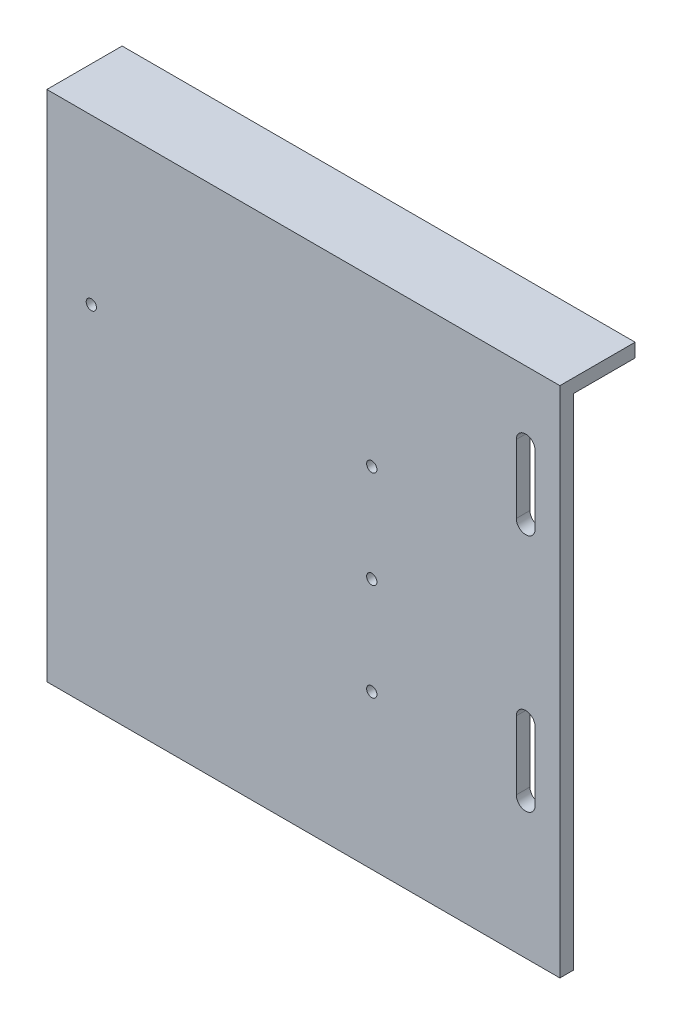
ISO-10303-21;
HEADER;
FILE_DESCRIPTION(('STEP AP214'),'2;1');
FILE_NAME('part.step','',(''),(''),'','','');
FILE_SCHEMA(('AUTOMOTIVE_DESIGN { 1 0 10303 214 1 1 1 1 }'));
ENDSEC;
DATA;
#1=APPLICATION_CONTEXT('core data for automotive mechanical design processes');
#2=APPLICATION_PROTOCOL_DEFINITION('international standard','automotive_design',2000,#1);
#3=PRODUCT_CONTEXT('',#1,'mechanical');
#4=PRODUCT('Part','Part','',(#3));
#5=PRODUCT_RELATED_PRODUCT_CATEGORY('part','',(#4));
#6=PRODUCT_DEFINITION_FORMATION('','',#4);
#7=PRODUCT_DEFINITION_CONTEXT('part definition',#1,'design');
#8=PRODUCT_DEFINITION('design','',#6,#7);
#9=PRODUCT_DEFINITION_SHAPE('','',#8);
#10=(LENGTH_UNIT() NAMED_UNIT(*) SI_UNIT(.MILLI.,.METRE.));
#11=(NAMED_UNIT(*) PLANE_ANGLE_UNIT() SI_UNIT($,.RADIAN.));
#12=(NAMED_UNIT(*) SI_UNIT($,.STERADIAN.) SOLID_ANGLE_UNIT());
#13=UNCERTAINTY_MEASURE_WITH_UNIT(LENGTH_MEASURE(1.E-05),#10,'distance_accuracy_value','');
#14=(GEOMETRIC_REPRESENTATION_CONTEXT(3) GLOBAL_UNCERTAINTY_ASSIGNED_CONTEXT((#13)) GLOBAL_UNIT_ASSIGNED_CONTEXT((#10,
#11,#12)) REPRESENTATION_CONTEXT('',''));
#15=CARTESIAN_POINT('',(0.,0.,0.));
#16=DIRECTION('',(0.,0.,1.));
#17=DIRECTION('',(1.,0.,0.));
#18=AXIS2_PLACEMENT_3D('',#15,#16,#17);
#19=CARTESIAN_POINT('',(0.,0.,4.));
#20=DIRECTION('',(0.,0.,-1.));
#21=DIRECTION('',(-1.,0.,0.));
#22=AXIS2_PLACEMENT_3D('',#19,#20,#21);
#23=PLANE('',#22);
#24=CARTESIAN_POINT('',(140.,130.,4.));
#25=DIRECTION('',(0.,0.,1.));
#26=DIRECTION('',(1.,0.,0.));
#27=AXIS2_PLACEMENT_3D('',#24,#25,#26);
#28=CIRCLE('',#27,2.75000000000003);
#29=CARTESIAN_POINT('',(142.75,130.,4.));
#30=VERTEX_POINT('',#29);
#31=CARTESIAN_POINT('',(137.25,130.,4.));
#32=VERTEX_POINT('',#31);
#33=EDGE_CURVE('E219',#30,#32,#28,.T.);
#34=ORIENTED_EDGE('',*,*,#33,.F.);
#35=DIRECTION('',(0.,1.,0.));
#36=VECTOR('',#35,1.);
#37=CARTESIAN_POINT('',(142.75,130.,4.));
#38=LINE('',#37,#36);
#39=CARTESIAN_POINT('',(142.75,110.,4.));
#40=VERTEX_POINT('',#39);
#41=EDGE_CURVE('E227',#40,#30,#38,.T.);
#42=ORIENTED_EDGE('',*,*,#41,.F.);
#43=CARTESIAN_POINT('',(140.,110.,4.));
#44=DIRECTION('',(0.,0.,1.));
#45=DIRECTION('',(1.,0.,0.));
#46=AXIS2_PLACEMENT_3D('',#43,#44,#45);
#47=CIRCLE('',#46,2.75);
#48=CARTESIAN_POINT('',(137.25,110.,4.));
#49=VERTEX_POINT('',#48);
#50=EDGE_CURVE('E224',#49,#40,#47,.T.);
#51=ORIENTED_EDGE('',*,*,#50,.F.);
#52=DIRECTION('',(0.,-1.,0.));
#53=VECTOR('',#52,1.);
#54=CARTESIAN_POINT('',(137.25,130.,4.));
#55=LINE('',#54,#53);
#56=EDGE_CURVE('E221',#32,#49,#55,.T.);
#57=ORIENTED_EDGE('',*,*,#56,.F.);
#58=EDGE_LOOP('',(#34,#42,#51,#57));
#59=FACE_BOUND('',#58,.T.);
#60=DIRECTION('',(0.,-1.,0.));
#61=VECTOR('',#60,1.);
#62=CARTESIAN_POINT('',(0.,0.,4.));
#63=LINE('',#62,#61);
#64=CARTESIAN_POINT('',(0.,150.,4.));
#65=VERTEX_POINT('',#64);
#66=CARTESIAN_POINT('',(0.,0.,4.));
#67=VERTEX_POINT('',#66);
#68=EDGE_CURVE('E250',#65,#67,#63,.T.);
#69=ORIENTED_EDGE('',*,*,#68,.T.);
#70=DIRECTION('',(1.,0.,0.));
#71=VECTOR('',#70,1.);
#72=CARTESIAN_POINT('',(0.,0.,4.));
#73=LINE('',#72,#71);
#74=CARTESIAN_POINT('',(150.,0.,4.));
#75=VERTEX_POINT('',#74);
#76=EDGE_CURVE('E253',#67,#75,#73,.T.);
#77=ORIENTED_EDGE('',*,*,#76,.T.);
#78=DIRECTION('',(0.,1.,0.));
#79=VECTOR('',#78,1.);
#80=CARTESIAN_POINT('',(150.,0.,4.));
#81=LINE('',#80,#79);
#82=CARTESIAN_POINT('',(150.,150.,4.));
#83=VERTEX_POINT('',#82);
#84=EDGE_CURVE('E255',#75,#83,#81,.T.);
#85=ORIENTED_EDGE('',*,*,#84,.T.);
#86=DIRECTION('',(-1.,0.,0.));
#87=VECTOR('',#86,1.);
#88=CARTESIAN_POINT('',(0.,150.,4.));
#89=LINE('',#88,#87);
#90=EDGE_CURVE('E257',#83,#65,#89,.T.);
#91=ORIENTED_EDGE('',*,*,#90,.T.);
#92=EDGE_LOOP('',(#69,#77,#85,#91));
#93=FACE_BOUND('',#92,.T.);
#94=CARTESIAN_POINT('',(140.,60.,4.));
#95=DIRECTION('',(0.,0.,1.));
#96=DIRECTION('',(1.,0.,0.));
#97=AXIS2_PLACEMENT_3D('',#94,#95,#96);
#98=CIRCLE('',#97,2.74999999999997);
#99=CARTESIAN_POINT('',(142.75,60.,4.));
#100=VERTEX_POINT('',#99);
#101=CARTESIAN_POINT('',(137.25,60.,4.));
#102=VERTEX_POINT('',#101);
#103=EDGE_CURVE('E190',#100,#102,#98,.T.);
#104=ORIENTED_EDGE('',*,*,#103,.F.);
#105=DIRECTION('',(0.,1.,0.));
#106=VECTOR('',#105,1.);
#107=CARTESIAN_POINT('',(142.75,60.,4.));
#108=LINE('',#107,#106);
#109=CARTESIAN_POINT('',(142.75,40.,4.));
#110=VERTEX_POINT('',#109);
#111=EDGE_CURVE('E197',#110,#100,#108,.T.);
#112=ORIENTED_EDGE('',*,*,#111,.F.);
#113=CARTESIAN_POINT('',(140.,40.,4.));
#114=DIRECTION('',(0.,0.,1.));
#115=DIRECTION('',(1.,0.,0.));
#116=AXIS2_PLACEMENT_3D('',#113,#114,#115);
#117=CIRCLE('',#116,2.74999999999997);
#118=CARTESIAN_POINT('',(137.25,40.,4.));
#119=VERTEX_POINT('',#118);
#120=EDGE_CURVE('E195',#119,#110,#117,.T.);
#121=ORIENTED_EDGE('',*,*,#120,.F.);
#122=DIRECTION('',(0.,-1.,0.));
#123=VECTOR('',#122,1.);
#124=CARTESIAN_POINT('',(137.25,60.,4.));
#125=LINE('',#124,#123);
#126=EDGE_CURVE('E192',#102,#119,#125,.T.);
#127=ORIENTED_EDGE('',*,*,#126,.F.);
#128=EDGE_LOOP('',(#104,#112,#121,#127));
#129=FACE_BOUND('',#128,.T.);
#130=CARTESIAN_POINT('',(95.,102.,4.));
#131=DIRECTION('',(0.,0.,1.));
#132=DIRECTION('',(1.,0.,0.));
#133=AXIS2_PLACEMENT_3D('',#130,#131,#132);
#134=CIRCLE('',#133,1.5);
#135=CARTESIAN_POINT('',(96.5,102.,4.));
#136=VERTEX_POINT('',#135);
#137=EDGE_CURVE('E184',#136,#136,#134,.T.);
#138=ORIENTED_EDGE('',*,*,#137,.F.);
#139=EDGE_LOOP('',(#138));
#140=FACE_BOUND('',#139,.T.);
#141=CARTESIAN_POINT('',(95.,45.,4.));
#142=DIRECTION('',(0.,0.,1.));
#143=DIRECTION('',(1.,0.,0.));
#144=AXIS2_PLACEMENT_3D('',#141,#142,#143);
#145=CIRCLE('',#144,1.5);
#146=CARTESIAN_POINT('',(96.5,45.,4.));
#147=VERTEX_POINT('',#146);
#148=EDGE_CURVE('E178',#147,#147,#145,.T.);
#149=ORIENTED_EDGE('',*,*,#148,.F.);
#150=EDGE_LOOP('',(#149));
#151=FACE_BOUND('',#150,.T.);
#152=CARTESIAN_POINT('',(95.,73.5,4.));
#153=DIRECTION('',(0.,0.,1.));
#154=DIRECTION('',(1.,0.,0.));
#155=AXIS2_PLACEMENT_3D('',#152,#153,#154);
#156=CIRCLE('',#155,1.5);
#157=CARTESIAN_POINT('',(96.5,73.5,4.));
#158=VERTEX_POINT('',#157);
#159=EDGE_CURVE('E172',#158,#158,#156,.T.);
#160=ORIENTED_EDGE('',*,*,#159,.F.);
#161=EDGE_LOOP('',(#160));
#162=FACE_BOUND('',#161,.T.);
#163=CARTESIAN_POINT('',(13.,102.,4.));
#164=DIRECTION('',(0.,0.,1.));
#165=DIRECTION('',(1.,0.,0.));
#166=AXIS2_PLACEMENT_3D('',#163,#164,#165);
#167=CIRCLE('',#166,1.5);
#168=CARTESIAN_POINT('',(14.5,102.,4.));
#169=VERTEX_POINT('',#168);
#170=EDGE_CURVE('E164',#169,#169,#167,.T.);
#171=ORIENTED_EDGE('',*,*,#170,.F.);
#172=EDGE_LOOP('',(#171));
#173=FACE_BOUND('',#172,.T.);
#174=ADVANCED_FACE('F35',(#59,#93,#129,#140,#151,#162,#173),#23,.F.);
#175=CARTESIAN_POINT('',(0.,0.,0.));
#176=DIRECTION('',(0.,0.,-1.));
#177=DIRECTION('',(-1.,0.,0.));
#178=AXIS2_PLACEMENT_3D('',#175,#176,#177);
#179=PLANE('',#178);
#180=DIRECTION('',(-1.,0.,0.));
#181=VECTOR('',#180,1.);
#182=CARTESIAN_POINT('',(150.,146.,0.));
#183=LINE('',#182,#181);
#184=CARTESIAN_POINT('',(150.,146.,0.));
#185=VERTEX_POINT('',#184);
#186=CARTESIAN_POINT('',(0.,146.,0.));
#187=VERTEX_POINT('',#186);
#188=EDGE_CURVE('E50',#185,#187,#183,.T.);
#189=ORIENTED_EDGE('',*,*,#188,.F.);
#190=DIRECTION('',(0.,1.,0.));
#191=VECTOR('',#190,1.);
#192=CARTESIAN_POINT('',(150.,0.,0.));
#193=LINE('',#192,#191);
#194=CARTESIAN_POINT('',(150.,0.,0.));
#195=VERTEX_POINT('',#194);
#196=EDGE_CURVE('E160',#195,#185,#193,.T.);
#197=ORIENTED_EDGE('',*,*,#196,.F.);
#198=DIRECTION('',(1.,0.,0.));
#199=VECTOR('',#198,1.);
#200=CARTESIAN_POINT('',(0.,0.,0.));
#201=LINE('',#200,#199);
#202=CARTESIAN_POINT('',(0.,0.,0.));
#203=VERTEX_POINT('',#202);
#204=EDGE_CURVE('E261',#203,#195,#201,.T.);
#205=ORIENTED_EDGE('',*,*,#204,.F.);
#206=DIRECTION('',(0.,-1.,0.));
#207=VECTOR('',#206,1.);
#208=CARTESIAN_POINT('',(0.,0.,0.));
#209=LINE('',#208,#207);
#210=EDGE_CURVE('E249',#187,#203,#209,.T.);
#211=ORIENTED_EDGE('',*,*,#210,.F.);
#212=EDGE_LOOP('',(#189,#197,#205,#211));
#213=FACE_BOUND('',#212,.T.);
#214=CARTESIAN_POINT('',(95.,73.5,0.));
#215=DIRECTION('',(0.,0.,1.));
#216=DIRECTION('',(1.,0.,0.));
#217=AXIS2_PLACEMENT_3D('',#214,#215,#216);
#218=CIRCLE('',#217,1.5);
#219=CARTESIAN_POINT('',(96.5,73.5,0.));
#220=VERTEX_POINT('',#219);
#221=EDGE_CURVE('E170',#220,#220,#218,.T.);
#222=ORIENTED_EDGE('',*,*,#221,.T.);
#223=EDGE_LOOP('',(#222));
#224=FACE_BOUND('',#223,.T.);
#225=CARTESIAN_POINT('',(95.,102.,0.));
#226=DIRECTION('',(0.,0.,1.));
#227=DIRECTION('',(1.,0.,0.));
#228=AXIS2_PLACEMENT_3D('',#225,#226,#227);
#229=CIRCLE('',#228,1.5);
#230=CARTESIAN_POINT('',(96.5,102.,0.));
#231=VERTEX_POINT('',#230);
#232=EDGE_CURVE('E181',#231,#231,#229,.T.);
#233=ORIENTED_EDGE('',*,*,#232,.T.);
#234=EDGE_LOOP('',(#233));
#235=FACE_BOUND('',#234,.T.);
#236=DIRECTION('',(0.,1.,0.));
#237=VECTOR('',#236,1.);
#238=CARTESIAN_POINT('',(142.75,130.,0.));
#239=LINE('',#238,#237);
#240=CARTESIAN_POINT('',(142.75,110.,0.));
#241=VERTEX_POINT('',#240);
#242=CARTESIAN_POINT('',(142.75,130.,0.));
#243=VERTEX_POINT('',#242);
#244=EDGE_CURVE('E222',#241,#243,#239,.T.);
#245=ORIENTED_EDGE('',*,*,#244,.T.);
#246=CARTESIAN_POINT('',(140.,130.,0.));
#247=DIRECTION('',(0.,0.,1.));
#248=DIRECTION('',(1.,0.,0.));
#249=AXIS2_PLACEMENT_3D('',#246,#247,#248);
#250=CIRCLE('',#249,2.75000000000003);
#251=CARTESIAN_POINT('',(137.25,130.,0.));
#252=VERTEX_POINT('',#251);
#253=EDGE_CURVE('E218',#243,#252,#250,.T.);
#254=ORIENTED_EDGE('',*,*,#253,.T.);
#255=DIRECTION('',(0.,-1.,0.));
#256=VECTOR('',#255,1.);
#257=CARTESIAN_POINT('',(137.25,130.,0.));
#258=LINE('',#257,#256);
#259=CARTESIAN_POINT('',(137.25,110.,0.));
#260=VERTEX_POINT('',#259);
#261=EDGE_CURVE('E232',#252,#260,#258,.T.);
#262=ORIENTED_EDGE('',*,*,#261,.T.);
#263=CARTESIAN_POINT('',(140.,110.,0.));
#264=DIRECTION('',(0.,0.,1.));
#265=DIRECTION('',(1.,0.,0.));
#266=AXIS2_PLACEMENT_3D('',#263,#264,#265);
#267=CIRCLE('',#266,2.75);
#268=EDGE_CURVE('E235',#260,#241,#267,.T.);
#269=ORIENTED_EDGE('',*,*,#268,.T.);
#270=EDGE_LOOP('',(#245,#254,#262,#269));
#271=FACE_BOUND('',#270,.T.);
#272=DIRECTION('',(0.,1.,0.));
#273=VECTOR('',#272,1.);
#274=CARTESIAN_POINT('',(142.75,60.,0.));
#275=LINE('',#274,#273);
#276=CARTESIAN_POINT('',(142.75,40.,0.));
#277=VERTEX_POINT('',#276);
#278=CARTESIAN_POINT('',(142.75,60.,0.));
#279=VERTEX_POINT('',#278);
#280=EDGE_CURVE('E193',#277,#279,#275,.T.);
#281=ORIENTED_EDGE('',*,*,#280,.T.);
#282=CARTESIAN_POINT('',(140.,60.,0.));
#283=DIRECTION('',(0.,0.,1.));
#284=DIRECTION('',(1.,0.,0.));
#285=AXIS2_PLACEMENT_3D('',#282,#283,#284);
#286=CIRCLE('',#285,2.74999999999997);
#287=CARTESIAN_POINT('',(137.25,60.,0.));
#288=VERTEX_POINT('',#287);
#289=EDGE_CURVE('E187',#279,#288,#286,.T.);
#290=ORIENTED_EDGE('',*,*,#289,.T.);
#291=DIRECTION('',(0.,-1.,0.));
#292=VECTOR('',#291,1.);
#293=CARTESIAN_POINT('',(137.25,60.,0.));
#294=LINE('',#293,#292);
#295=CARTESIAN_POINT('',(137.25,40.,0.));
#296=VERTEX_POINT('',#295);
#297=EDGE_CURVE('E202',#288,#296,#294,.T.);
#298=ORIENTED_EDGE('',*,*,#297,.T.);
#299=CARTESIAN_POINT('',(140.,40.,0.));
#300=DIRECTION('',(0.,0.,1.));
#301=DIRECTION('',(1.,0.,0.));
#302=AXIS2_PLACEMENT_3D('',#299,#300,#301);
#303=CIRCLE('',#302,2.74999999999997);
#304=EDGE_CURVE('E205',#296,#277,#303,.T.);
#305=ORIENTED_EDGE('',*,*,#304,.T.);
#306=EDGE_LOOP('',(#281,#290,#298,#305));
#307=FACE_BOUND('',#306,.T.);
#308=CARTESIAN_POINT('',(95.,45.,0.));
#309=DIRECTION('',(0.,0.,1.));
#310=DIRECTION('',(1.,0.,0.));
#311=AXIS2_PLACEMENT_3D('',#308,#309,#310);
#312=CIRCLE('',#311,1.5);
#313=CARTESIAN_POINT('',(96.5,45.,0.));
#314=VERTEX_POINT('',#313);
#315=EDGE_CURVE('E175',#314,#314,#312,.T.);
#316=ORIENTED_EDGE('',*,*,#315,.T.);
#317=EDGE_LOOP('',(#316));
#318=FACE_BOUND('',#317,.T.);
#319=CARTESIAN_POINT('',(13.,102.,0.));
#320=DIRECTION('',(0.,0.,1.));
#321=DIRECTION('',(1.,0.,0.));
#322=AXIS2_PLACEMENT_3D('',#319,#320,#321);
#323=CIRCLE('',#322,1.5);
#324=CARTESIAN_POINT('',(14.5,102.,0.));
#325=VERTEX_POINT('',#324);
#326=EDGE_CURVE('E161',#325,#325,#323,.T.);
#327=ORIENTED_EDGE('',*,*,#326,.T.);
#328=EDGE_LOOP('',(#327));
#329=FACE_BOUND('',#328,.T.);
#330=ADVANCED_FACE('F270',(#213,#224,#235,#271,#307,#318,#329),#179,.T.);
#331=CARTESIAN_POINT('',(0.,0.,4.));
#332=DIRECTION('',(1.,0.,0.));
#333=DIRECTION('',(0.,0.,-1.));
#334=AXIS2_PLACEMENT_3D('',#331,#332,#333);
#335=PLANE('',#334);
#336=DIRECTION('',(0.,0.,-1.));
#337=VECTOR('',#336,1.);
#338=CARTESIAN_POINT('',(0.,150.,4.));
#339=LINE('',#338,#337);
#340=CARTESIAN_POINT('',(0.,150.,-18.));
#341=VERTEX_POINT('',#340);
#342=EDGE_CURVE('E259',#65,#341,#339,.T.);
#343=ORIENTED_EDGE('',*,*,#342,.T.);
#344=DIRECTION('',(0.,1.,0.));
#345=VECTOR('',#344,1.);
#346=CARTESIAN_POINT('',(0.,150.,-18.));
#347=LINE('',#346,#345);
#348=CARTESIAN_POINT('',(0.,146.,-18.));
#349=VERTEX_POINT('',#348);
#350=EDGE_CURVE('E147',#349,#341,#347,.T.);
#351=ORIENTED_EDGE('',*,*,#350,.F.);
#352=DIRECTION('',(0.,0.,1.));
#353=VECTOR('',#352,1.);
#354=CARTESIAN_POINT('',(0.,146.,-18.));
#355=LINE('',#354,#353);
#356=EDGE_CURVE('E143',#349,#187,#355,.T.);
#357=ORIENTED_EDGE('',*,*,#356,.T.);
#358=ORIENTED_EDGE('',*,*,#210,.T.);
#359=DIRECTION('',(0.,0.,-1.));
#360=VECTOR('',#359,1.);
#361=CARTESIAN_POINT('',(0.,0.,4.));
#362=LINE('',#361,#360);
#363=EDGE_CURVE('E11',#67,#203,#362,.T.);
#364=ORIENTED_EDGE('',*,*,#363,.F.);
#365=ORIENTED_EDGE('',*,*,#68,.F.);
#366=EDGE_LOOP('',(#343,#351,#357,#358,#364,#365));
#367=FACE_BOUND('',#366,.T.);
#368=ADVANCED_FACE('F37',(#367),#335,.F.);
#369=CARTESIAN_POINT('',(0.,0.,4.));
#370=DIRECTION('',(0.,1.,0.));
#371=DIRECTION('',(0.,0.,1.));
#372=AXIS2_PLACEMENT_3D('',#369,#370,#371);
#373=PLANE('',#372);
#374=ORIENTED_EDGE('',*,*,#204,.T.);
#375=DIRECTION('',(0.,0.,-1.));
#376=VECTOR('',#375,1.);
#377=CARTESIAN_POINT('',(150.,0.,4.));
#378=LINE('',#377,#376);
#379=EDGE_CURVE('E43',#75,#195,#378,.T.);
#380=ORIENTED_EDGE('',*,*,#379,.F.);
#381=ORIENTED_EDGE('',*,*,#76,.F.);
#382=ORIENTED_EDGE('',*,*,#363,.T.);
#383=EDGE_LOOP('',(#374,#380,#381,#382));
#384=FACE_BOUND('',#383,.T.);
#385=ADVANCED_FACE('F273',(#384),#373,.F.);
#386=CARTESIAN_POINT('',(150.,0.,4.));
#387=DIRECTION('',(-1.,0.,0.));
#388=DIRECTION('',(0.,0.,1.));
#389=AXIS2_PLACEMENT_3D('',#386,#387,#388);
#390=PLANE('',#389);
#391=ORIENTED_EDGE('',*,*,#196,.T.);
#392=DIRECTION('',(0.,0.,1.));
#393=VECTOR('',#392,1.);
#394=CARTESIAN_POINT('',(150.,146.,-18.));
#395=LINE('',#394,#393);
#396=CARTESIAN_POINT('',(150.,146.,-18.));
#397=VERTEX_POINT('',#396);
#398=EDGE_CURVE('E141',#397,#185,#395,.T.);
#399=ORIENTED_EDGE('',*,*,#398,.F.);
#400=DIRECTION('',(0.,-1.,0.));
#401=VECTOR('',#400,1.);
#402=CARTESIAN_POINT('',(150.,150.,-18.));
#403=LINE('',#402,#401);
#404=CARTESIAN_POINT('',(150.,150.,-18.));
#405=VERTEX_POINT('',#404);
#406=EDGE_CURVE('E148',#405,#397,#403,.T.);
#407=ORIENTED_EDGE('',*,*,#406,.F.);
#408=DIRECTION('',(0.,0.,-1.));
#409=VECTOR('',#408,1.);
#410=CARTESIAN_POINT('',(150.,150.,4.));
#411=LINE('',#410,#409);
#412=EDGE_CURVE('E265',#83,#405,#411,.T.);
#413=ORIENTED_EDGE('',*,*,#412,.F.);
#414=ORIENTED_EDGE('',*,*,#84,.F.);
#415=ORIENTED_EDGE('',*,*,#379,.T.);
#416=EDGE_LOOP('',(#391,#399,#407,#413,#414,#415));
#417=FACE_BOUND('',#416,.T.);
#418=ADVANCED_FACE('F158',(#417),#390,.F.);
#419=CARTESIAN_POINT('',(0.,150.,4.));
#420=DIRECTION('',(0.,-1.,0.));
#421=DIRECTION('',(0.,0.,-1.));
#422=AXIS2_PLACEMENT_3D('',#419,#420,#421);
#423=PLANE('',#422);
#424=ORIENTED_EDGE('',*,*,#412,.T.);
#425=DIRECTION('',(1.,0.,0.));
#426=VECTOR('',#425,1.);
#427=CARTESIAN_POINT('',(150.,150.,-18.));
#428=LINE('',#427,#426);
#429=EDGE_CURVE('E154',#341,#405,#428,.T.);
#430=ORIENTED_EDGE('',*,*,#429,.F.);
#431=ORIENTED_EDGE('',*,*,#342,.F.);
#432=ORIENTED_EDGE('',*,*,#90,.F.);
#433=EDGE_LOOP('',(#424,#430,#431,#432));
#434=FACE_BOUND('',#433,.T.);
#435=ADVANCED_FACE('F280',(#434),#423,.F.);
#436=CARTESIAN_POINT('',(140.,130.,4.));
#437=DIRECTION('',(0.,0.,-1.));
#438=DIRECTION('',(-1.,0.,0.));
#439=AXIS2_PLACEMENT_3D('',#436,#437,#438);
#440=CYLINDRICAL_SURFACE('',#439,2.75000000000003);
#441=ORIENTED_EDGE('',*,*,#253,.F.);
#442=DIRECTION('',(0.,0.,-1.));
#443=VECTOR('',#442,1.);
#444=CARTESIAN_POINT('',(142.75,130.,4.));
#445=LINE('',#444,#443);
#446=EDGE_CURVE('E229',#30,#243,#445,.T.);
#447=ORIENTED_EDGE('',*,*,#446,.F.);
#448=ORIENTED_EDGE('',*,*,#33,.T.);
#449=DIRECTION('',(0.,0.,-1.));
#450=VECTOR('',#449,1.);
#451=CARTESIAN_POINT('',(137.25,130.,4.));
#452=LINE('',#451,#450);
#453=EDGE_CURVE('E246',#32,#252,#452,.T.);
#454=ORIENTED_EDGE('',*,*,#453,.T.);
#455=EDGE_LOOP('',(#441,#447,#448,#454));
#456=FACE_BOUND('',#455,.T.);
#457=ADVANCED_FACE('F315',(#456),#440,.F.);
#458=CARTESIAN_POINT('',(137.25,130.,4.));
#459=DIRECTION('',(1.,0.,0.));
#460=DIRECTION('',(0.,1.,0.));
#461=AXIS2_PLACEMENT_3D('',#458,#459,#460);
#462=PLANE('',#461);
#463=ORIENTED_EDGE('',*,*,#261,.F.);
#464=ORIENTED_EDGE('',*,*,#453,.F.);
#465=ORIENTED_EDGE('',*,*,#56,.T.);
#466=DIRECTION('',(0.,0.,-1.));
#467=VECTOR('',#466,1.);
#468=CARTESIAN_POINT('',(137.25,110.,4.));
#469=LINE('',#468,#467);
#470=EDGE_CURVE('E244',#49,#260,#469,.T.);
#471=ORIENTED_EDGE('',*,*,#470,.T.);
#472=EDGE_LOOP('',(#463,#464,#465,#471));
#473=FACE_BOUND('',#472,.T.);
#474=ADVANCED_FACE('F338',(#473),#462,.T.);
#475=CARTESIAN_POINT('',(140.,110.,4.));
#476=DIRECTION('',(0.,0.,-1.));
#477=DIRECTION('',(-1.,0.,0.));
#478=AXIS2_PLACEMENT_3D('',#475,#476,#477);
#479=CYLINDRICAL_SURFACE('',#478,2.75);
#480=ORIENTED_EDGE('',*,*,#268,.F.);
#481=ORIENTED_EDGE('',*,*,#470,.F.);
#482=ORIENTED_EDGE('',*,*,#50,.T.);
#483=DIRECTION('',(0.,0.,-1.));
#484=VECTOR('',#483,1.);
#485=CARTESIAN_POINT('',(142.75,110.,4.));
#486=LINE('',#485,#484);
#487=EDGE_CURVE('E242',#40,#241,#486,.T.);
#488=ORIENTED_EDGE('',*,*,#487,.T.);
#489=EDGE_LOOP('',(#480,#481,#482,#488));
#490=FACE_BOUND('',#489,.T.);
#491=ADVANCED_FACE('F345',(#490),#479,.F.);
#492=CARTESIAN_POINT('',(142.75,130.,4.));
#493=DIRECTION('',(-1.,0.,0.));
#494=DIRECTION('',(0.,-1.,0.));
#495=AXIS2_PLACEMENT_3D('',#492,#493,#494);
#496=PLANE('',#495);
#497=ORIENTED_EDGE('',*,*,#244,.F.);
#498=ORIENTED_EDGE('',*,*,#487,.F.);
#499=ORIENTED_EDGE('',*,*,#41,.T.);
#500=ORIENTED_EDGE('',*,*,#446,.T.);
#501=EDGE_LOOP('',(#497,#498,#499,#500));
#502=FACE_BOUND('',#501,.T.);
#503=ADVANCED_FACE('F353',(#502),#496,.T.);
#504=CARTESIAN_POINT('',(140.,60.,4.));
#505=DIRECTION('',(0.,0.,-1.));
#506=DIRECTION('',(-1.,0.,0.));
#507=AXIS2_PLACEMENT_3D('',#504,#505,#506);
#508=CYLINDRICAL_SURFACE('',#507,2.74999999999997);
#509=ORIENTED_EDGE('',*,*,#289,.F.);
#510=DIRECTION('',(0.,0.,-1.));
#511=VECTOR('',#510,1.);
#512=CARTESIAN_POINT('',(142.75,60.,4.));
#513=LINE('',#512,#511);
#514=EDGE_CURVE('E199',#100,#279,#513,.T.);
#515=ORIENTED_EDGE('',*,*,#514,.F.);
#516=ORIENTED_EDGE('',*,*,#103,.T.);
#517=DIRECTION('',(0.,0.,-1.));
#518=VECTOR('',#517,1.);
#519=CARTESIAN_POINT('',(137.25,60.,4.));
#520=LINE('',#519,#518);
#521=EDGE_CURVE('E215',#102,#288,#520,.T.);
#522=ORIENTED_EDGE('',*,*,#521,.T.);
#523=EDGE_LOOP('',(#509,#515,#516,#522));
#524=FACE_BOUND('',#523,.T.);
#525=ADVANCED_FACE('F361',(#524),#508,.F.);
#526=CARTESIAN_POINT('',(137.25,60.,4.));
#527=DIRECTION('',(1.,0.,0.));
#528=DIRECTION('',(0.,0.,-1.));
#529=AXIS2_PLACEMENT_3D('',#526,#527,#528);
#530=PLANE('',#529);
#531=ORIENTED_EDGE('',*,*,#297,.F.);
#532=ORIENTED_EDGE('',*,*,#521,.F.);
#533=ORIENTED_EDGE('',*,*,#126,.T.);
#534=DIRECTION('',(0.,0.,-1.));
#535=VECTOR('',#534,1.);
#536=CARTESIAN_POINT('',(137.25,40.,4.));
#537=LINE('',#536,#535);
#538=EDGE_CURVE('E213',#119,#296,#537,.T.);
#539=ORIENTED_EDGE('',*,*,#538,.T.);
#540=EDGE_LOOP('',(#531,#532,#533,#539));
#541=FACE_BOUND('',#540,.T.);
#542=ADVANCED_FACE('F369',(#541),#530,.T.);
#543=CARTESIAN_POINT('',(140.,40.,4.));
#544=DIRECTION('',(0.,0.,-1.));
#545=DIRECTION('',(-1.,0.,0.));
#546=AXIS2_PLACEMENT_3D('',#543,#544,#545);
#547=CYLINDRICAL_SURFACE('',#546,2.74999999999997);
#548=ORIENTED_EDGE('',*,*,#304,.F.);
#549=ORIENTED_EDGE('',*,*,#538,.F.);
#550=ORIENTED_EDGE('',*,*,#120,.T.);
#551=DIRECTION('',(0.,0.,-1.));
#552=VECTOR('',#551,1.);
#553=CARTESIAN_POINT('',(142.75,40.,4.));
#554=LINE('',#553,#552);
#555=EDGE_CURVE('E58',#110,#277,#554,.T.);
#556=ORIENTED_EDGE('',*,*,#555,.T.);
#557=EDGE_LOOP('',(#548,#549,#550,#556));
#558=FACE_BOUND('',#557,.T.);
#559=ADVANCED_FACE('F377',(#558),#547,.F.);
#560=CARTESIAN_POINT('',(142.75,60.,4.));
#561=DIRECTION('',(-1.,0.,0.));
#562=DIRECTION('',(0.,0.,1.));
#563=AXIS2_PLACEMENT_3D('',#560,#561,#562);
#564=PLANE('',#563);
#565=ORIENTED_EDGE('',*,*,#280,.F.);
#566=ORIENTED_EDGE('',*,*,#555,.F.);
#567=ORIENTED_EDGE('',*,*,#111,.T.);
#568=ORIENTED_EDGE('',*,*,#514,.T.);
#569=EDGE_LOOP('',(#565,#566,#567,#568));
#570=FACE_BOUND('',#569,.T.);
#571=ADVANCED_FACE('F385',(#570),#564,.T.);
#572=CARTESIAN_POINT('',(95.,102.,4.));
#573=DIRECTION('',(0.,0.,-1.));
#574=DIRECTION('',(-1.,0.,0.));
#575=AXIS2_PLACEMENT_3D('',#572,#573,#574);
#576=CYLINDRICAL_SURFACE('',#575,1.5);
#577=ORIENTED_EDGE('',*,*,#137,.T.);
#578=EDGE_LOOP('',(#577));
#579=FACE_BOUND('',#578,.T.);
#580=ORIENTED_EDGE('',*,*,#232,.F.);
#581=EDGE_LOOP('',(#580));
#582=FACE_BOUND('',#581,.T.);
#583=ADVANCED_FACE('F393',(#579,#582),#576,.F.);
#584=CARTESIAN_POINT('',(95.,45.,4.));
#585=DIRECTION('',(0.,0.,-1.));
#586=DIRECTION('',(-1.,0.,0.));
#587=AXIS2_PLACEMENT_3D('',#584,#585,#586);
#588=CYLINDRICAL_SURFACE('',#587,1.5);
#589=ORIENTED_EDGE('',*,*,#148,.T.);
#590=EDGE_LOOP('',(#589));
#591=FACE_BOUND('',#590,.T.);
#592=ORIENTED_EDGE('',*,*,#315,.F.);
#593=EDGE_LOOP('',(#592));
#594=FACE_BOUND('',#593,.T.);
#595=ADVANCED_FACE('F400',(#591,#594),#588,.F.);
#596=CARTESIAN_POINT('',(95.,73.5,4.));
#597=DIRECTION('',(0.,0.,-1.));
#598=DIRECTION('',(-1.,0.,0.));
#599=AXIS2_PLACEMENT_3D('',#596,#597,#598);
#600=CYLINDRICAL_SURFACE('',#599,1.5);
#601=ORIENTED_EDGE('',*,*,#159,.T.);
#602=EDGE_LOOP('',(#601));
#603=FACE_BOUND('',#602,.T.);
#604=ORIENTED_EDGE('',*,*,#221,.F.);
#605=EDGE_LOOP('',(#604));
#606=FACE_BOUND('',#605,.T.);
#607=ADVANCED_FACE('F302',(#603,#606),#600,.F.);
#608=CARTESIAN_POINT('',(13.,102.,4.));
#609=DIRECTION('',(0.,0.,-1.));
#610=DIRECTION('',(-1.,0.,0.));
#611=AXIS2_PLACEMENT_3D('',#608,#609,#610);
#612=CYLINDRICAL_SURFACE('',#611,1.5);
#613=ORIENTED_EDGE('',*,*,#170,.T.);
#614=EDGE_LOOP('',(#613));
#615=FACE_BOUND('',#614,.T.);
#616=ORIENTED_EDGE('',*,*,#326,.F.);
#617=EDGE_LOOP('',(#616));
#618=FACE_BOUND('',#617,.T.);
#619=ADVANCED_FACE('F299',(#615,#618),#612,.F.);
#620=CARTESIAN_POINT('',(150.,146.,-18.));
#621=DIRECTION('',(0.,1.,0.));
#622=DIRECTION('',(0.,0.,1.));
#623=AXIS2_PLACEMENT_3D('',#620,#621,#622);
#624=PLANE('',#623);
#625=ORIENTED_EDGE('',*,*,#188,.T.);
#626=ORIENTED_EDGE('',*,*,#356,.F.);
#627=DIRECTION('',(-1.,0.,0.));
#628=VECTOR('',#627,1.);
#629=CARTESIAN_POINT('',(150.,146.,-18.));
#630=LINE('',#629,#628);
#631=EDGE_CURVE('E137',#397,#349,#630,.T.);
#632=ORIENTED_EDGE('',*,*,#631,.F.);
#633=ORIENTED_EDGE('',*,*,#398,.T.);
#634=EDGE_LOOP('',(#625,#626,#632,#633));
#635=FACE_BOUND('',#634,.T.);
#636=ADVANCED_FACE('F139',(#635),#624,.F.);
#637=CARTESIAN_POINT('',(0.,0.,-18.));
#638=DIRECTION('',(0.,0.,-1.));
#639=DIRECTION('',(-1.,0.,0.));
#640=AXIS2_PLACEMENT_3D('',#637,#638,#639);
#641=PLANE('',#640);
#642=ORIENTED_EDGE('',*,*,#406,.T.);
#643=ORIENTED_EDGE('',*,*,#631,.T.);
#644=ORIENTED_EDGE('',*,*,#350,.T.);
#645=ORIENTED_EDGE('',*,*,#429,.T.);
#646=EDGE_LOOP('',(#642,#643,#644,#645));
#647=FACE_BOUND('',#646,.T.);
#648=ADVANCED_FACE('F152',(#647),#641,.T.);
#649=CLOSED_SHELL('',(#174,#330,#368,#385,#418,#435,#457,#474,#491,#503,#525,#542,#559,#571,
#583,#595,#607,#619,#636,#648));
#650=MANIFOLD_SOLID_BREP('B2',#649);
#651=ADVANCED_BREP_SHAPE_REPRESENTATION('',(#18,#650),#14);
#652=SHAPE_DEFINITION_REPRESENTATION(#9,#651);
ENDSEC;
END-ISO-10303-21;
